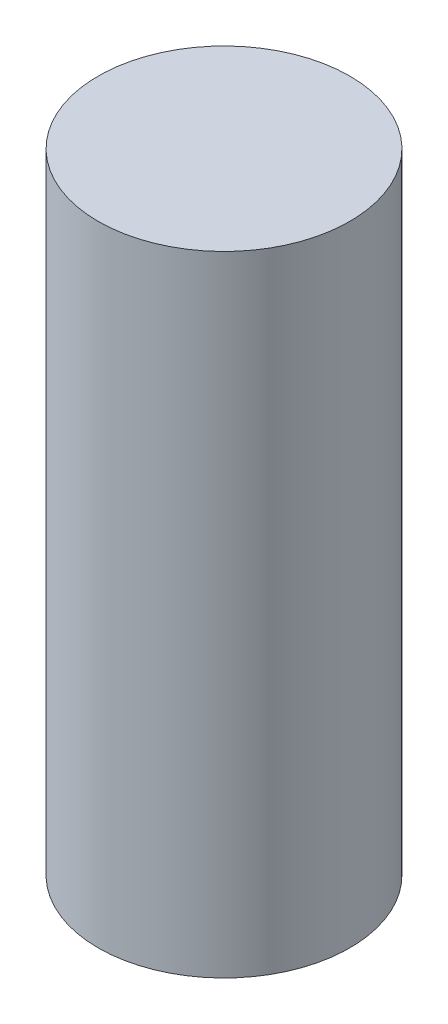
ISO-10303-21;
HEADER;
FILE_DESCRIPTION(('STEP AP214'),'2;1');
FILE_NAME('part.step','',(''),(''),'','','');
FILE_SCHEMA(('AUTOMOTIVE_DESIGN { 1 0 10303 214 1 1 1 1 }'));
ENDSEC;
DATA;
#1=APPLICATION_CONTEXT('core data for automotive mechanical design processes');
#2=APPLICATION_PROTOCOL_DEFINITION('international standard','automotive_design',2000,#1);
#3=PRODUCT_CONTEXT('',#1,'mechanical');
#4=PRODUCT('Part','Part','',(#3));
#5=PRODUCT_RELATED_PRODUCT_CATEGORY('part','',(#4));
#6=PRODUCT_DEFINITION_FORMATION('','',#4);
#7=PRODUCT_DEFINITION_CONTEXT('part definition',#1,'design');
#8=PRODUCT_DEFINITION('design','',#6,#7);
#9=PRODUCT_DEFINITION_SHAPE('','',#8);
#10=(LENGTH_UNIT() NAMED_UNIT(*) SI_UNIT(.MILLI.,.METRE.));
#11=(NAMED_UNIT(*) PLANE_ANGLE_UNIT() SI_UNIT($,.RADIAN.));
#12=(NAMED_UNIT(*) SI_UNIT($,.STERADIAN.) SOLID_ANGLE_UNIT());
#13=UNCERTAINTY_MEASURE_WITH_UNIT(LENGTH_MEASURE(1.E-05),#10,'distance_accuracy_value','');
#14=(GEOMETRIC_REPRESENTATION_CONTEXT(3) GLOBAL_UNCERTAINTY_ASSIGNED_CONTEXT((#13)) GLOBAL_UNIT_ASSIGNED_CONTEXT((#10,
#11,#12)) REPRESENTATION_CONTEXT('',''));
#15=CARTESIAN_POINT('',(0.,0.,0.));
#16=DIRECTION('',(0.,0.,1.));
#17=DIRECTION('',(1.,0.,0.));
#18=AXIS2_PLACEMENT_3D('',#15,#16,#17);
#19=CARTESIAN_POINT('',(0.,50.8,0.));
#20=DIRECTION('',(0.,-1.,0.));
#21=DIRECTION('',(0.,0.,-1.));
#22=AXIS2_PLACEMENT_3D('',#19,#20,#21);
#23=CYLINDRICAL_SURFACE('',#22,10.16);
#24=CARTESIAN_POINT('',(0.,50.8,0.));
#25=DIRECTION('',(0.,1.,0.));
#26=DIRECTION('',(0.,0.,1.));
#27=AXIS2_PLACEMENT_3D('',#24,#25,#26);
#28=CIRCLE('',#27,10.16);
#29=CARTESIAN_POINT('',(0.,50.8,10.16));
#30=VERTEX_POINT('',#29);
#31=EDGE_CURVE('E10',#30,#30,#28,.T.);
#32=ORIENTED_EDGE('',*,*,#31,.F.);
#33=EDGE_LOOP('',(#32));
#34=FACE_BOUND('',#33,.T.);
#35=CARTESIAN_POINT('',(0.,0.,0.));
#36=DIRECTION('',(0.,1.,0.));
#37=DIRECTION('',(0.,0.,1.));
#38=AXIS2_PLACEMENT_3D('',#35,#36,#37);
#39=CIRCLE('',#38,10.16);
#40=CARTESIAN_POINT('',(0.,0.,10.16));
#41=VERTEX_POINT('',#40);
#42=EDGE_CURVE('E34',#41,#41,#39,.T.);
#43=ORIENTED_EDGE('',*,*,#42,.T.);
#44=EDGE_LOOP('',(#43));
#45=FACE_BOUND('',#44,.T.);
#46=ADVANCED_FACE('F31',(#34,#45),#23,.T.);
#47=CARTESIAN_POINT('',(0.,50.8,0.));
#48=DIRECTION('',(0.,1.,0.));
#49=DIRECTION('',(0.,0.,1.));
#50=AXIS2_PLACEMENT_3D('',#47,#48,#49);
#51=PLANE('',#50);
#52=ORIENTED_EDGE('',*,*,#31,.T.);
#53=EDGE_LOOP('',(#52));
#54=FACE_BOUND('',#53,.T.);
#55=ADVANCED_FACE('F46',(#54),#51,.T.);
#56=CARTESIAN_POINT('',(0.,0.,0.));
#57=DIRECTION('',(0.,1.,0.));
#58=DIRECTION('',(0.,0.,1.));
#59=AXIS2_PLACEMENT_3D('',#56,#57,#58);
#60=PLANE('',#59);
#61=ORIENTED_EDGE('',*,*,#42,.F.);
#62=EDGE_LOOP('',(#61));
#63=FACE_BOUND('',#62,.T.);
#64=ADVANCED_FACE('F44',(#63),#60,.F.);
#65=CLOSED_SHELL('',(#46,#55,#64));
#66=MANIFOLD_SOLID_BREP('B2',#65);
#67=ADVANCED_BREP_SHAPE_REPRESENTATION('',(#18,#66),#14);
#68=SHAPE_DEFINITION_REPRESENTATION(#9,#67);
ENDSEC;
END-ISO-10303-21;
